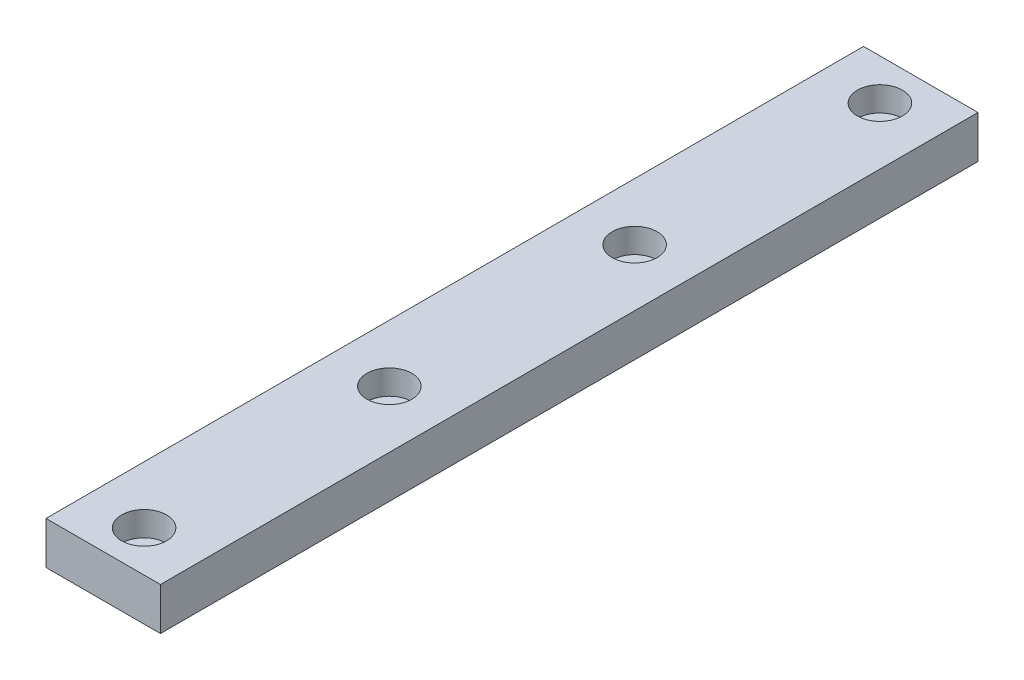
ISO-10303-21;
HEADER;
FILE_DESCRIPTION(('STEP AP214'),'2;1');
FILE_NAME('part.step','',(''),(''),'','','');
FILE_SCHEMA(('AUTOMOTIVE_DESIGN { 1 0 10303 214 1 1 1 1 }'));
ENDSEC;
DATA;
#1=APPLICATION_CONTEXT('core data for automotive mechanical design processes');
#2=APPLICATION_PROTOCOL_DEFINITION('international standard','automotive_design',2000,#1);
#3=PRODUCT_CONTEXT('',#1,'mechanical');
#4=PRODUCT('Part','Part','',(#3));
#5=PRODUCT_RELATED_PRODUCT_CATEGORY('part','',(#4));
#6=PRODUCT_DEFINITION_FORMATION('','',#4);
#7=PRODUCT_DEFINITION_CONTEXT('part definition',#1,'design');
#8=PRODUCT_DEFINITION('design','',#6,#7);
#9=PRODUCT_DEFINITION_SHAPE('','',#8);
#10=(LENGTH_UNIT() NAMED_UNIT(*) SI_UNIT(.MILLI.,.METRE.));
#11=(NAMED_UNIT(*) PLANE_ANGLE_UNIT() SI_UNIT($,.RADIAN.));
#12=(NAMED_UNIT(*) SI_UNIT($,.STERADIAN.) SOLID_ANGLE_UNIT());
#13=UNCERTAINTY_MEASURE_WITH_UNIT(LENGTH_MEASURE(1.E-05),#10,'distance_accuracy_value','');
#14=(GEOMETRIC_REPRESENTATION_CONTEXT(3) GLOBAL_UNCERTAINTY_ASSIGNED_CONTEXT((#13)) GLOBAL_UNIT_ASSIGNED_CONTEXT((#10,
#11,#12)) REPRESENTATION_CONTEXT('',''));
#15=CARTESIAN_POINT('',(0.,0.,0.));
#16=DIRECTION('',(0.,0.,1.));
#17=DIRECTION('',(1.,0.,0.));
#18=AXIS2_PLACEMENT_3D('',#15,#16,#17);
#19=CARTESIAN_POINT('',(7.,-2.6,50.));
#20=DIRECTION('',(-1.,0.,0.));
#21=DIRECTION('',(0.,0.,1.));
#22=AXIS2_PLACEMENT_3D('',#19,#20,#21);
#23=PLANE('',#22);
#24=DIRECTION('',(0.,1.,0.));
#25=VECTOR('',#24,1.);
#26=CARTESIAN_POINT('',(7.,-2.6,-50.));
#27=LINE('',#26,#25);
#28=CARTESIAN_POINT('',(7.,-2.6,-50.));
#29=VERTEX_POINT('',#28);
#30=CARTESIAN_POINT('',(7.,2.6,-50.));
#31=VERTEX_POINT('',#30);
#32=EDGE_CURVE('E104',#29,#31,#27,.T.);
#33=ORIENTED_EDGE('',*,*,#32,.T.);
#34=DIRECTION('',(0.,0.,-1.));
#35=VECTOR('',#34,1.);
#36=CARTESIAN_POINT('',(7.,2.6,50.));
#37=LINE('',#36,#35);
#38=CARTESIAN_POINT('',(7.,2.6,50.));
#39=VERTEX_POINT('',#38);
#40=EDGE_CURVE('E11',#39,#31,#37,.T.);
#41=ORIENTED_EDGE('',*,*,#40,.F.);
#42=DIRECTION('',(0.,1.,0.));
#43=VECTOR('',#42,1.);
#44=CARTESIAN_POINT('',(7.,-2.6,50.));
#45=LINE('',#44,#43);
#46=CARTESIAN_POINT('',(7.,-2.6,50.));
#47=VERTEX_POINT('',#46);
#48=EDGE_CURVE('E91',#47,#39,#45,.T.);
#49=ORIENTED_EDGE('',*,*,#48,.F.);
#50=DIRECTION('',(0.,0.,-1.));
#51=VECTOR('',#50,1.);
#52=CARTESIAN_POINT('',(7.,-2.6,50.));
#53=LINE('',#52,#51);
#54=EDGE_CURVE('E100',#47,#29,#53,.T.);
#55=ORIENTED_EDGE('',*,*,#54,.T.);
#56=EDGE_LOOP('',(#33,#41,#49,#55));
#57=FACE_BOUND('',#56,.T.);
#58=ADVANCED_FACE('F38',(#57),#23,.F.);
#59=CARTESIAN_POINT('',(-7.,2.6,50.));
#60=DIRECTION('',(0.,-1.,0.));
#61=DIRECTION('',(0.,0.,-1.));
#62=AXIS2_PLACEMENT_3D('',#59,#60,#61);
#63=PLANE('',#62);
#64=CARTESIAN_POINT('',(0.,2.6,45.));
#65=DIRECTION('',(0.,1.,0.));
#66=DIRECTION('',(0.,0.,1.));
#67=AXIS2_PLACEMENT_3D('',#64,#65,#66);
#68=CIRCLE('',#67,2.75);
#69=CARTESIAN_POINT('',(0.,2.6,47.75));
#70=VERTEX_POINT('',#69);
#71=EDGE_CURVE('E147',#70,#70,#68,.T.);
#72=ORIENTED_EDGE('',*,*,#71,.F.);
#73=EDGE_LOOP('',(#72));
#74=FACE_BOUND('',#73,.T.);
#75=CARTESIAN_POINT('',(0.,2.6,15.));
#76=DIRECTION('',(0.,1.,0.));
#77=DIRECTION('',(0.,0.,1.));
#78=AXIS2_PLACEMENT_3D('',#75,#76,#77);
#79=CIRCLE('',#78,2.75);
#80=CARTESIAN_POINT('',(0.,2.6,17.75));
#81=VERTEX_POINT('',#80);
#82=EDGE_CURVE('E141',#81,#81,#79,.T.);
#83=ORIENTED_EDGE('',*,*,#82,.F.);
#84=EDGE_LOOP('',(#83));
#85=FACE_BOUND('',#84,.T.);
#86=CARTESIAN_POINT('',(0.,2.6,-15.));
#87=DIRECTION('',(0.,1.,0.));
#88=DIRECTION('',(0.,0.,1.));
#89=AXIS2_PLACEMENT_3D('',#86,#87,#88);
#90=CIRCLE('',#89,2.75);
#91=CARTESIAN_POINT('',(0.,2.6,-12.25));
#92=VERTEX_POINT('',#91);
#93=EDGE_CURVE('E133',#92,#92,#90,.T.);
#94=ORIENTED_EDGE('',*,*,#93,.F.);
#95=EDGE_LOOP('',(#94));
#96=FACE_BOUND('',#95,.T.);
#97=CARTESIAN_POINT('',(0.,2.6,-45.));
#98=DIRECTION('',(0.,1.,0.));
#99=DIRECTION('',(0.,0.,1.));
#100=AXIS2_PLACEMENT_3D('',#97,#98,#99);
#101=CIRCLE('',#100,2.75);
#102=CARTESIAN_POINT('',(0.,2.6,-42.25));
#103=VERTEX_POINT('',#102);
#104=EDGE_CURVE('E124',#103,#103,#101,.T.);
#105=ORIENTED_EDGE('',*,*,#104,.F.);
#106=EDGE_LOOP('',(#105));
#107=FACE_BOUND('',#106,.T.);
#108=DIRECTION('',(-1.,0.,0.));
#109=VECTOR('',#108,1.);
#110=CARTESIAN_POINT('',(-7.,2.6,-50.));
#111=LINE('',#110,#109);
#112=CARTESIAN_POINT('',(-7.,2.6,-50.));
#113=VERTEX_POINT('',#112);
#114=EDGE_CURVE('E95',#31,#113,#111,.T.);
#115=ORIENTED_EDGE('',*,*,#114,.T.);
#116=DIRECTION('',(0.,0.,-1.));
#117=VECTOR('',#116,1.);
#118=CARTESIAN_POINT('',(-7.,2.6,50.));
#119=LINE('',#118,#117);
#120=CARTESIAN_POINT('',(-7.,2.6,50.));
#121=VERTEX_POINT('',#120);
#122=EDGE_CURVE('E47',#121,#113,#119,.T.);
#123=ORIENTED_EDGE('',*,*,#122,.F.);
#124=DIRECTION('',(-1.,0.,0.));
#125=VECTOR('',#124,1.);
#126=CARTESIAN_POINT('',(-7.,2.6,50.));
#127=LINE('',#126,#125);
#128=EDGE_CURVE('E86',#39,#121,#127,.T.);
#129=ORIENTED_EDGE('',*,*,#128,.F.);
#130=ORIENTED_EDGE('',*,*,#40,.T.);
#131=EDGE_LOOP('',(#115,#123,#129,#130));
#132=FACE_BOUND('',#131,.T.);
#133=ADVANCED_FACE('F94',(#74,#85,#96,#107,#132),#63,.F.);
#134=CARTESIAN_POINT('',(-7.,-2.6,50.));
#135=DIRECTION('',(1.,0.,0.));
#136=DIRECTION('',(0.,0.,-1.));
#137=AXIS2_PLACEMENT_3D('',#134,#135,#136);
#138=PLANE('',#137);
#139=DIRECTION('',(0.,-1.,0.));
#140=VECTOR('',#139,1.);
#141=CARTESIAN_POINT('',(-7.,-2.6,-50.));
#142=LINE('',#141,#140);
#143=CARTESIAN_POINT('',(-7.,-2.6,-50.));
#144=VERTEX_POINT('',#143);
#145=EDGE_CURVE('E73',#113,#144,#142,.T.);
#146=ORIENTED_EDGE('',*,*,#145,.T.);
#147=DIRECTION('',(0.,0.,-1.));
#148=VECTOR('',#147,1.);
#149=CARTESIAN_POINT('',(-7.,-2.6,50.));
#150=LINE('',#149,#148);
#151=CARTESIAN_POINT('',(-7.,-2.6,50.));
#152=VERTEX_POINT('',#151);
#153=EDGE_CURVE('E96',#152,#144,#150,.T.);
#154=ORIENTED_EDGE('',*,*,#153,.F.);
#155=DIRECTION('',(0.,-1.,0.));
#156=VECTOR('',#155,1.);
#157=CARTESIAN_POINT('',(-7.,-2.6,50.));
#158=LINE('',#157,#156);
#159=EDGE_CURVE('E89',#121,#152,#158,.T.);
#160=ORIENTED_EDGE('',*,*,#159,.F.);
#161=ORIENTED_EDGE('',*,*,#122,.T.);
#162=EDGE_LOOP('',(#146,#154,#160,#161));
#163=FACE_BOUND('',#162,.T.);
#164=ADVANCED_FACE('F98',(#163),#138,.F.);
#165=CARTESIAN_POINT('',(-7.,-2.6,50.));
#166=DIRECTION('',(0.,1.,0.));
#167=DIRECTION('',(0.,0.,1.));
#168=AXIS2_PLACEMENT_3D('',#165,#166,#167);
#169=PLANE('',#168);
#170=CARTESIAN_POINT('',(0.,-2.6,45.));
#171=DIRECTION('',(0.,1.,0.));
#172=DIRECTION('',(0.,0.,1.));
#173=AXIS2_PLACEMENT_3D('',#170,#171,#172);
#174=CIRCLE('',#173,1.5);
#175=CARTESIAN_POINT('',(0.,-2.6,46.5));
#176=VERTEX_POINT('',#175);
#177=EDGE_CURVE('E117',#176,#176,#174,.T.);
#178=ORIENTED_EDGE('',*,*,#177,.T.);
#179=EDGE_LOOP('',(#178));
#180=FACE_BOUND('',#179,.T.);
#181=CARTESIAN_POINT('',(0.,-2.6,15.));
#182=DIRECTION('',(0.,1.,0.));
#183=DIRECTION('',(0.,0.,1.));
#184=AXIS2_PLACEMENT_3D('',#181,#182,#183);
#185=CIRCLE('',#184,1.5);
#186=CARTESIAN_POINT('',(0.,-2.6,16.5));
#187=VERTEX_POINT('',#186);
#188=EDGE_CURVE('E158',#187,#187,#185,.T.);
#189=ORIENTED_EDGE('',*,*,#188,.T.);
#190=EDGE_LOOP('',(#189));
#191=FACE_BOUND('',#190,.T.);
#192=CARTESIAN_POINT('',(0.,-2.6,-15.));
#193=DIRECTION('',(0.,1.,0.));
#194=DIRECTION('',(0.,0.,1.));
#195=AXIS2_PLACEMENT_3D('',#192,#193,#194);
#196=CIRCLE('',#195,1.5);
#197=CARTESIAN_POINT('',(0.,-2.6,-13.5));
#198=VERTEX_POINT('',#197);
#199=EDGE_CURVE('E155',#198,#198,#196,.T.);
#200=ORIENTED_EDGE('',*,*,#199,.T.);
#201=EDGE_LOOP('',(#200));
#202=FACE_BOUND('',#201,.T.);
#203=CARTESIAN_POINT('',(0.,-2.6,-45.));
#204=DIRECTION('',(0.,1.,0.));
#205=DIRECTION('',(0.,0.,1.));
#206=AXIS2_PLACEMENT_3D('',#203,#204,#205);
#207=CIRCLE('',#206,1.5);
#208=CARTESIAN_POINT('',(0.,-2.6,-43.5));
#209=VERTEX_POINT('',#208);
#210=EDGE_CURVE('E152',#209,#209,#207,.T.);
#211=ORIENTED_EDGE('',*,*,#210,.T.);
#212=EDGE_LOOP('',(#211));
#213=FACE_BOUND('',#212,.T.);
#214=DIRECTION('',(1.,0.,0.));
#215=VECTOR('',#214,1.);
#216=CARTESIAN_POINT('',(-7.,-2.6,-50.));
#217=LINE('',#216,#215);
#218=EDGE_CURVE('E79',#144,#29,#217,.T.);
#219=ORIENTED_EDGE('',*,*,#218,.T.);
#220=ORIENTED_EDGE('',*,*,#54,.F.);
#221=DIRECTION('',(1.,0.,0.));
#222=VECTOR('',#221,1.);
#223=CARTESIAN_POINT('',(-7.,-2.6,50.));
#224=LINE('',#223,#222);
#225=EDGE_CURVE('E56',#152,#47,#224,.T.);
#226=ORIENTED_EDGE('',*,*,#225,.F.);
#227=ORIENTED_EDGE('',*,*,#153,.T.);
#228=EDGE_LOOP('',(#219,#220,#226,#227));
#229=FACE_BOUND('',#228,.T.);
#230=ADVANCED_FACE('F164',(#180,#191,#202,#213,#229),#169,.F.);
#231=CARTESIAN_POINT('',(0.,0.,50.));
#232=DIRECTION('',(0.,0.,-1.));
#233=DIRECTION('',(-1.,0.,0.));
#234=AXIS2_PLACEMENT_3D('',#231,#232,#233);
#235=PLANE('',#234);
#236=ORIENTED_EDGE('',*,*,#48,.T.);
#237=ORIENTED_EDGE('',*,*,#128,.T.);
#238=ORIENTED_EDGE('',*,*,#159,.T.);
#239=ORIENTED_EDGE('',*,*,#225,.T.);
#240=EDGE_LOOP('',(#236,#237,#238,#239));
#241=FACE_BOUND('',#240,.T.);
#242=ADVANCED_FACE('F87',(#241),#235,.F.);
#243=CARTESIAN_POINT('',(0.,0.,-50.));
#244=DIRECTION('',(0.,0.,-1.));
#245=DIRECTION('',(-1.,0.,0.));
#246=AXIS2_PLACEMENT_3D('',#243,#244,#245);
#247=PLANE('',#246);
#248=ORIENTED_EDGE('',*,*,#32,.F.);
#249=ORIENTED_EDGE('',*,*,#218,.F.);
#250=ORIENTED_EDGE('',*,*,#145,.F.);
#251=ORIENTED_EDGE('',*,*,#114,.F.);
#252=EDGE_LOOP('',(#248,#249,#250,#251));
#253=FACE_BOUND('',#252,.T.);
#254=ADVANCED_FACE('F191',(#253),#247,.T.);
#255=CARTESIAN_POINT('',(0.,-0.400000000000001,-45.));
#256=DIRECTION('',(0.,1.,0.));
#257=DIRECTION('',(0.,0.,1.));
#258=AXIS2_PLACEMENT_3D('',#255,#256,#257);
#259=CYLINDRICAL_SURFACE('',#258,2.75);
#260=CARTESIAN_POINT('',(0.,-0.400000000000001,-45.));
#261=DIRECTION('',(0.,1.,0.));
#262=DIRECTION('',(0.,0.,1.));
#263=AXIS2_PLACEMENT_3D('',#260,#261,#262);
#264=CIRCLE('',#263,2.75);
#265=CARTESIAN_POINT('',(0.,-0.400000000000001,-42.25));
#266=VERTEX_POINT('',#265);
#267=EDGE_CURVE('E128',#266,#266,#264,.T.);
#268=ORIENTED_EDGE('',*,*,#267,.F.);
#269=EDGE_LOOP('',(#268));
#270=FACE_BOUND('',#269,.T.);
#271=ORIENTED_EDGE('',*,*,#104,.T.);
#272=EDGE_LOOP('',(#271));
#273=FACE_BOUND('',#272,.T.);
#274=ADVANCED_FACE('F193',(#270,#273),#259,.F.);
#275=CARTESIAN_POINT('',(0.,-0.400000000000001,-45.));
#276=DIRECTION('',(0.,1.,0.));
#277=DIRECTION('',(0.,0.,1.));
#278=AXIS2_PLACEMENT_3D('',#275,#276,#277);
#279=PLANE('',#278);
#280=CARTESIAN_POINT('',(0.,-0.400000000000001,-45.));
#281=DIRECTION('',(0.,1.,0.));
#282=DIRECTION('',(0.,0.,1.));
#283=AXIS2_PLACEMENT_3D('',#280,#281,#282);
#284=CIRCLE('',#283,1.5);
#285=CARTESIAN_POINT('',(0.,-0.400000000000001,-43.5));
#286=VERTEX_POINT('',#285);
#287=EDGE_CURVE('E41',#286,#286,#284,.T.);
#288=ORIENTED_EDGE('',*,*,#287,.F.);
#289=EDGE_LOOP('',(#288));
#290=FACE_BOUND('',#289,.T.);
#291=ORIENTED_EDGE('',*,*,#267,.T.);
#292=EDGE_LOOP('',(#291));
#293=FACE_BOUND('',#292,.T.);
#294=ADVANCED_FACE('F199',(#290,#293),#279,.T.);
#295=CARTESIAN_POINT('',(0.,-0.400000000000001,-15.));
#296=DIRECTION('',(0.,1.,0.));
#297=DIRECTION('',(0.,0.,1.));
#298=AXIS2_PLACEMENT_3D('',#295,#296,#297);
#299=CYLINDRICAL_SURFACE('',#298,2.75);
#300=CARTESIAN_POINT('',(0.,-0.400000000000001,-15.));
#301=DIRECTION('',(0.,1.,0.));
#302=DIRECTION('',(0.,0.,1.));
#303=AXIS2_PLACEMENT_3D('',#300,#301,#302);
#304=CIRCLE('',#303,2.75);
#305=CARTESIAN_POINT('',(0.,-0.400000000000001,-12.25));
#306=VERTEX_POINT('',#305);
#307=EDGE_CURVE('E138',#306,#306,#304,.T.);
#308=ORIENTED_EDGE('',*,*,#307,.F.);
#309=EDGE_LOOP('',(#308));
#310=FACE_BOUND('',#309,.T.);
#311=ORIENTED_EDGE('',*,*,#93,.T.);
#312=EDGE_LOOP('',(#311));
#313=FACE_BOUND('',#312,.T.);
#314=ADVANCED_FACE('F243',(#310,#313),#299,.F.);
#315=CARTESIAN_POINT('',(0.,-0.400000000000001,-15.));
#316=DIRECTION('',(0.,1.,0.));
#317=DIRECTION('',(0.,0.,1.));
#318=AXIS2_PLACEMENT_3D('',#315,#316,#317);
#319=PLANE('',#318);
#320=CARTESIAN_POINT('',(0.,-0.400000000000001,-15.));
#321=DIRECTION('',(0.,1.,0.));
#322=DIRECTION('',(0.,0.,1.));
#323=AXIS2_PLACEMENT_3D('',#320,#321,#322);
#324=CIRCLE('',#323,1.5);
#325=CARTESIAN_POINT('',(0.,-0.400000000000001,-13.5));
#326=VERTEX_POINT('',#325);
#327=EDGE_CURVE('E119',#326,#326,#324,.T.);
#328=ORIENTED_EDGE('',*,*,#327,.F.);
#329=EDGE_LOOP('',(#328));
#330=FACE_BOUND('',#329,.T.);
#331=ORIENTED_EDGE('',*,*,#307,.T.);
#332=EDGE_LOOP('',(#331));
#333=FACE_BOUND('',#332,.T.);
#334=ADVANCED_FACE('F248',(#330,#333),#319,.T.);
#335=CARTESIAN_POINT('',(0.,-0.400000000000001,15.));
#336=DIRECTION('',(0.,1.,0.));
#337=DIRECTION('',(0.,0.,1.));
#338=AXIS2_PLACEMENT_3D('',#335,#336,#337);
#339=CYLINDRICAL_SURFACE('',#338,2.75);
#340=CARTESIAN_POINT('',(0.,-0.400000000000001,15.));
#341=DIRECTION('',(0.,1.,0.));
#342=DIRECTION('',(0.,0.,1.));
#343=AXIS2_PLACEMENT_3D('',#340,#341,#342);
#344=CIRCLE('',#343,2.75);
#345=CARTESIAN_POINT('',(0.,-0.400000000000001,17.75));
#346=VERTEX_POINT('',#345);
#347=EDGE_CURVE('E144',#346,#346,#344,.T.);
#348=ORIENTED_EDGE('',*,*,#347,.F.);
#349=EDGE_LOOP('',(#348));
#350=FACE_BOUND('',#349,.T.);
#351=ORIENTED_EDGE('',*,*,#82,.T.);
#352=EDGE_LOOP('',(#351));
#353=FACE_BOUND('',#352,.T.);
#354=ADVANCED_FACE('F256',(#350,#353),#339,.F.);
#355=CARTESIAN_POINT('',(0.,-0.400000000000001,15.));
#356=DIRECTION('',(0.,1.,0.));
#357=DIRECTION('',(0.,0.,1.));
#358=AXIS2_PLACEMENT_3D('',#355,#356,#357);
#359=PLANE('',#358);
#360=CARTESIAN_POINT('',(0.,-0.400000000000001,15.));
#361=DIRECTION('',(0.,1.,0.));
#362=DIRECTION('',(0.,0.,1.));
#363=AXIS2_PLACEMENT_3D('',#360,#361,#362);
#364=CIRCLE('',#363,1.5);
#365=CARTESIAN_POINT('',(0.,-0.400000000000001,16.5));
#366=VERTEX_POINT('',#365);
#367=EDGE_CURVE('E116',#366,#366,#364,.T.);
#368=ORIENTED_EDGE('',*,*,#367,.F.);
#369=EDGE_LOOP('',(#368));
#370=FACE_BOUND('',#369,.T.);
#371=ORIENTED_EDGE('',*,*,#347,.T.);
#372=EDGE_LOOP('',(#371));
#373=FACE_BOUND('',#372,.T.);
#374=ADVANCED_FACE('F260',(#370,#373),#359,.T.);
#375=CARTESIAN_POINT('',(0.,-0.400000000000001,45.));
#376=DIRECTION('',(0.,1.,0.));
#377=DIRECTION('',(0.,0.,1.));
#378=AXIS2_PLACEMENT_3D('',#375,#376,#377);
#379=CYLINDRICAL_SURFACE('',#378,2.75);
#380=CARTESIAN_POINT('',(0.,-0.400000000000001,45.));
#381=DIRECTION('',(0.,1.,0.));
#382=DIRECTION('',(0.,0.,1.));
#383=AXIS2_PLACEMENT_3D('',#380,#381,#382);
#384=CIRCLE('',#383,2.75);
#385=CARTESIAN_POINT('',(0.,-0.400000000000001,47.75));
#386=VERTEX_POINT('',#385);
#387=EDGE_CURVE('E107',#386,#386,#384,.T.);
#388=ORIENTED_EDGE('',*,*,#387,.F.);
#389=EDGE_LOOP('',(#388));
#390=FACE_BOUND('',#389,.T.);
#391=ORIENTED_EDGE('',*,*,#71,.T.);
#392=EDGE_LOOP('',(#391));
#393=FACE_BOUND('',#392,.T.);
#394=ADVANCED_FACE('F180',(#390,#393),#379,.F.);
#395=CARTESIAN_POINT('',(0.,-0.400000000000001,45.));
#396=DIRECTION('',(0.,1.,0.));
#397=DIRECTION('',(0.,0.,1.));
#398=AXIS2_PLACEMENT_3D('',#395,#396,#397);
#399=PLANE('',#398);
#400=CARTESIAN_POINT('',(0.,-0.400000000000001,45.));
#401=DIRECTION('',(0.,1.,0.));
#402=DIRECTION('',(0.,0.,1.));
#403=AXIS2_PLACEMENT_3D('',#400,#401,#402);
#404=CIRCLE('',#403,1.5);
#405=CARTESIAN_POINT('',(0.,-0.400000000000001,46.5));
#406=VERTEX_POINT('',#405);
#407=EDGE_CURVE('E113',#406,#406,#404,.T.);
#408=ORIENTED_EDGE('',*,*,#407,.F.);
#409=EDGE_LOOP('',(#408));
#410=FACE_BOUND('',#409,.T.);
#411=ORIENTED_EDGE('',*,*,#387,.T.);
#412=EDGE_LOOP('',(#411));
#413=FACE_BOUND('',#412,.T.);
#414=ADVANCED_FACE('F170',(#410,#413),#399,.T.);
#415=CARTESIAN_POINT('',(0.,-2.6,45.));
#416=DIRECTION('',(0.,1.,0.));
#417=DIRECTION('',(0.,0.,1.));
#418=AXIS2_PLACEMENT_3D('',#415,#416,#417);
#419=CYLINDRICAL_SURFACE('',#418,1.5);
#420=ORIENTED_EDGE('',*,*,#407,.T.);
#421=EDGE_LOOP('',(#420));
#422=FACE_BOUND('',#421,.T.);
#423=ORIENTED_EDGE('',*,*,#177,.F.);
#424=EDGE_LOOP('',(#423));
#425=FACE_BOUND('',#424,.T.);
#426=ADVANCED_FACE('F167',(#422,#425),#419,.F.);
#427=CARTESIAN_POINT('',(0.,-2.6,15.));
#428=DIRECTION('',(0.,1.,0.));
#429=DIRECTION('',(0.,0.,1.));
#430=AXIS2_PLACEMENT_3D('',#427,#428,#429);
#431=CYLINDRICAL_SURFACE('',#430,1.5);
#432=ORIENTED_EDGE('',*,*,#367,.T.);
#433=EDGE_LOOP('',(#432));
#434=FACE_BOUND('',#433,.T.);
#435=ORIENTED_EDGE('',*,*,#188,.F.);
#436=EDGE_LOOP('',(#435));
#437=FACE_BOUND('',#436,.T.);
#438=ADVANCED_FACE('F169',(#434,#437),#431,.F.);
#439=CARTESIAN_POINT('',(0.,-2.6,-15.));
#440=DIRECTION('',(0.,1.,0.));
#441=DIRECTION('',(0.,0.,1.));
#442=AXIS2_PLACEMENT_3D('',#439,#440,#441);
#443=CYLINDRICAL_SURFACE('',#442,1.5);
#444=ORIENTED_EDGE('',*,*,#327,.T.);
#445=EDGE_LOOP('',(#444));
#446=FACE_BOUND('',#445,.T.);
#447=ORIENTED_EDGE('',*,*,#199,.F.);
#448=EDGE_LOOP('',(#447));
#449=FACE_BOUND('',#448,.T.);
#450=ADVANCED_FACE('F177',(#446,#449),#443,.F.);
#451=CARTESIAN_POINT('',(0.,-2.6,-45.));
#452=DIRECTION('',(0.,1.,0.));
#453=DIRECTION('',(0.,0.,1.));
#454=AXIS2_PLACEMENT_3D('',#451,#452,#453);
#455=CYLINDRICAL_SURFACE('',#454,1.5);
#456=ORIENTED_EDGE('',*,*,#287,.T.);
#457=EDGE_LOOP('',(#456));
#458=FACE_BOUND('',#457,.T.);
#459=ORIENTED_EDGE('',*,*,#210,.F.);
#460=EDGE_LOOP('',(#459));
#461=FACE_BOUND('',#460,.T.);
#462=ADVANCED_FACE('F301',(#458,#461),#455,.F.);
#463=CLOSED_SHELL('',(#58,#133,#164,#230,#242,#254,#274,#294,#314,#334,#354,#374,#394,#414,#426,
#438,#450,#462));
#464=MANIFOLD_SOLID_BREP('B2',#463);
#465=ADVANCED_BREP_SHAPE_REPRESENTATION('',(#18,#464),#14);
#466=SHAPE_DEFINITION_REPRESENTATION(#9,#465);
ENDSEC;
END-ISO-10303-21;
